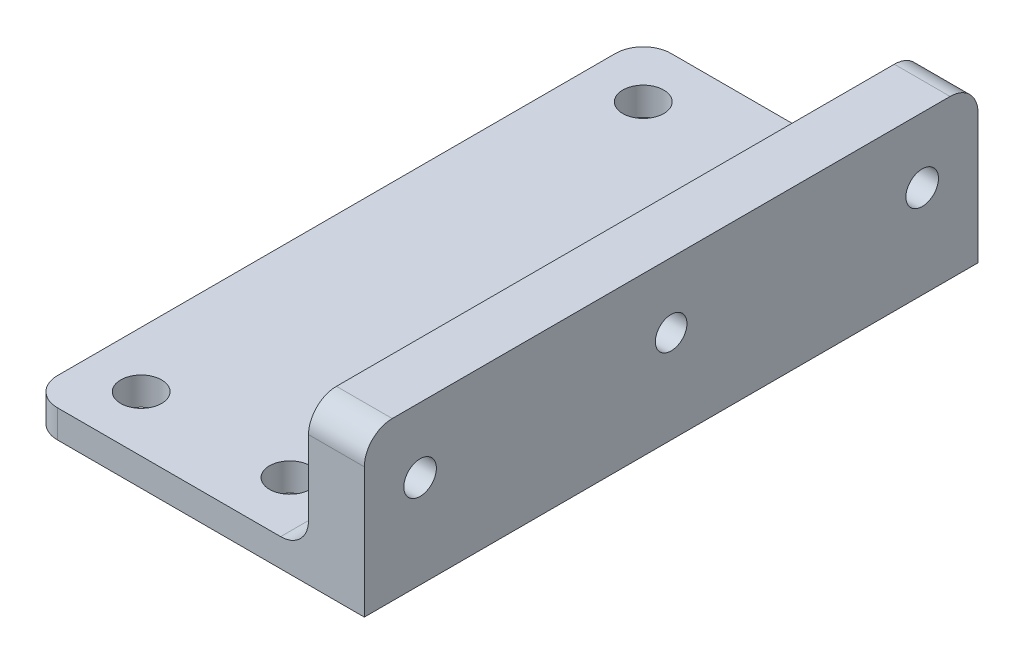
ISO-10303-21;
HEADER;
FILE_DESCRIPTION(('STEP AP214'),'2;1');
FILE_NAME('part.step','',(''),(''),'','','');
FILE_SCHEMA(('AUTOMOTIVE_DESIGN { 1 0 10303 214 1 1 1 1 }'));
ENDSEC;
DATA;
#1=APPLICATION_CONTEXT('core data for automotive mechanical design processes');
#2=APPLICATION_PROTOCOL_DEFINITION('international standard','automotive_design',2000,#1);
#3=PRODUCT_CONTEXT('',#1,'mechanical');
#4=PRODUCT('Part','Part','',(#3));
#5=PRODUCT_RELATED_PRODUCT_CATEGORY('part','',(#4));
#6=PRODUCT_DEFINITION_FORMATION('','',#4);
#7=PRODUCT_DEFINITION_CONTEXT('part definition',#1,'design');
#8=PRODUCT_DEFINITION('design','',#6,#7);
#9=PRODUCT_DEFINITION_SHAPE('','',#8);
#10=(LENGTH_UNIT() NAMED_UNIT(*) SI_UNIT(.MILLI.,.METRE.));
#11=(NAMED_UNIT(*) PLANE_ANGLE_UNIT() SI_UNIT($,.RADIAN.));
#12=(NAMED_UNIT(*) SI_UNIT($,.STERADIAN.) SOLID_ANGLE_UNIT());
#13=UNCERTAINTY_MEASURE_WITH_UNIT(LENGTH_MEASURE(1.E-05),#10,'distance_accuracy_value','');
#14=(GEOMETRIC_REPRESENTATION_CONTEXT(3) GLOBAL_UNCERTAINTY_ASSIGNED_CONTEXT((#13)) GLOBAL_UNIT_ASSIGNED_CONTEXT((#10,
#11,#12)) REPRESENTATION_CONTEXT('',''));
#15=CARTESIAN_POINT('',(0.,0.,0.));
#16=DIRECTION('',(0.,0.,1.));
#17=DIRECTION('',(1.,0.,0.));
#18=AXIS2_PLACEMENT_3D('',#15,#16,#17);
#19=CARTESIAN_POINT('',(0.,3.,0.));
#20=DIRECTION('',(0.,-1.,0.));
#21=DIRECTION('',(0.,0.,-1.));
#22=AXIS2_PLACEMENT_3D('',#19,#20,#21);
#23=PLANE('',#22);
#24=CARTESIAN_POINT('',(22.,3.,-60.));
#25=DIRECTION('',(0.,1.,0.));
#26=DIRECTION('',(0.,0.,-1.));
#27=AXIS2_PLACEMENT_3D('',#24,#25,#26);
#28=CIRCLE('',#27,2.2);
#29=CARTESIAN_POINT('',(22.,3.,-62.2));
#30=VERTEX_POINT('',#29);
#31=EDGE_CURVE('E277',#30,#30,#28,.T.);
#32=ORIENTED_EDGE('',*,*,#31,.F.);
#33=EDGE_LOOP('',(#32));
#34=FACE_BOUND('',#33,.T.);
#35=CARTESIAN_POINT('',(22.,3.,-6.));
#36=DIRECTION('',(0.,1.,0.));
#37=DIRECTION('',(0.,0.,1.));
#38=AXIS2_PLACEMENT_3D('',#35,#36,#37);
#39=CIRCLE('',#38,2.2);
#40=CARTESIAN_POINT('',(22.,3.,-3.8));
#41=VERTEX_POINT('',#40);
#42=EDGE_CURVE('E287',#41,#41,#39,.T.);
#43=ORIENTED_EDGE('',*,*,#42,.F.);
#44=EDGE_LOOP('',(#43));
#45=FACE_BOUND('',#44,.T.);
#46=CARTESIAN_POINT('',(6.,3.,-6.));
#47=DIRECTION('',(0.,1.,0.));
#48=DIRECTION('',(0.,0.,-1.));
#49=AXIS2_PLACEMENT_3D('',#46,#47,#48);
#50=CIRCLE('',#49,2.2);
#51=CARTESIAN_POINT('',(6.,3.,-8.2));
#52=VERTEX_POINT('',#51);
#53=EDGE_CURVE('E295',#52,#52,#50,.T.);
#54=ORIENTED_EDGE('',*,*,#53,.F.);
#55=EDGE_LOOP('',(#54));
#56=FACE_BOUND('',#55,.T.);
#57=CARTESIAN_POINT('',(6.,3.,-60.));
#58=DIRECTION('',(0.,1.,0.));
#59=DIRECTION('',(0.,0.,1.));
#60=AXIS2_PLACEMENT_3D('',#57,#58,#59);
#61=CIRCLE('',#60,2.2);
#62=CARTESIAN_POINT('',(6.,3.,-57.8));
#63=VERTEX_POINT('',#62);
#64=EDGE_CURVE('E303',#63,#63,#61,.T.);
#65=ORIENTED_EDGE('',*,*,#64,.F.);
#66=EDGE_LOOP('',(#65));
#67=FACE_BOUND('',#66,.T.);
#68=DIRECTION('',(0.,0.,1.));
#69=VECTOR('',#68,1.);
#70=CARTESIAN_POINT('',(0.,3.,0.));
#71=LINE('',#70,#69);
#72=CARTESIAN_POINT('',(0.,3.,-63.));
#73=VERTEX_POINT('',#72);
#74=CARTESIAN_POINT('',(0.,3.,-3.));
#75=VERTEX_POINT('',#74);
#76=EDGE_CURVE('E165',#73,#75,#71,.T.);
#77=ORIENTED_EDGE('',*,*,#76,.T.);
#78=CARTESIAN_POINT('',(3.,3.,-3.));
#79=DIRECTION('',(0.,-1.,0.));
#80=DIRECTION('',(0.,0.,-1.));
#81=AXIS2_PLACEMENT_3D('',#78,#79,#80);
#82=CIRCLE('',#81,3.);
#83=CARTESIAN_POINT('',(3.,3.,0.));
#84=VERTEX_POINT('',#83);
#85=EDGE_CURVE('E246',#75,#84,#82,.F.);
#86=ORIENTED_EDGE('',*,*,#85,.T.);
#87=DIRECTION('',(1.,0.,0.));
#88=VECTOR('',#87,1.);
#89=CARTESIAN_POINT('',(0.,3.,0.));
#90=LINE('',#89,#88);
#91=CARTESIAN_POINT('',(27.,3.,0.));
#92=VERTEX_POINT('',#91);
#93=EDGE_CURVE('E251',#84,#92,#90,.T.);
#94=ORIENTED_EDGE('',*,*,#93,.T.);
#95=DIRECTION('',(0.,0.,1.));
#96=VECTOR('',#95,1.);
#97=CARTESIAN_POINT('',(27.,3.,-66.));
#98=LINE('',#97,#96);
#99=CARTESIAN_POINT('',(27.,3.,-66.));
#100=VERTEX_POINT('',#99);
#101=EDGE_CURVE('E241',#92,#100,#98,.F.);
#102=ORIENTED_EDGE('',*,*,#101,.T.);
#103=DIRECTION('',(-1.,0.,0.));
#104=VECTOR('',#103,1.);
#105=CARTESIAN_POINT('',(0.,3.,-66.));
#106=LINE('',#105,#104);
#107=CARTESIAN_POINT('',(3.,3.,-66.));
#108=VERTEX_POINT('',#107);
#109=EDGE_CURVE('E170',#100,#108,#106,.T.);
#110=ORIENTED_EDGE('',*,*,#109,.T.);
#111=CARTESIAN_POINT('',(3.,3.,-63.));
#112=DIRECTION('',(0.,-1.,0.));
#113=DIRECTION('',(0.,0.,-1.));
#114=AXIS2_PLACEMENT_3D('',#111,#112,#113);
#115=CIRCLE('',#114,3.);
#116=EDGE_CURVE('E70',#108,#73,#115,.F.);
#117=ORIENTED_EDGE('',*,*,#116,.T.);
#118=EDGE_LOOP('',(#77,#86,#94,#102,#110,#117));
#119=FACE_BOUND('',#118,.T.);
#120=ADVANCED_FACE('F47',(#34,#45,#56,#67,#119),#23,.F.);
#121=CARTESIAN_POINT('',(0.,0.,0.));
#122=DIRECTION('',(0.,-1.,0.));
#123=DIRECTION('',(0.,0.,-1.));
#124=AXIS2_PLACEMENT_3D('',#121,#122,#123);
#125=PLANE('',#124);
#126=CARTESIAN_POINT('',(22.,0.,-6.));
#127=DIRECTION('',(0.,1.,0.));
#128=DIRECTION('',(0.,0.,1.));
#129=AXIS2_PLACEMENT_3D('',#126,#127,#128);
#130=CIRCLE('',#129,2.2);
#131=CARTESIAN_POINT('',(22.,0.,-3.8));
#132=VERTEX_POINT('',#131);
#133=EDGE_CURVE('E285',#132,#132,#130,.T.);
#134=ORIENTED_EDGE('',*,*,#133,.T.);
#135=EDGE_LOOP('',(#134));
#136=FACE_BOUND('',#135,.T.);
#137=CARTESIAN_POINT('',(6.,0.,-60.));
#138=DIRECTION('',(0.,1.,0.));
#139=DIRECTION('',(0.,0.,1.));
#140=AXIS2_PLACEMENT_3D('',#137,#138,#139);
#141=CIRCLE('',#140,2.2);
#142=CARTESIAN_POINT('',(6.,0.,-57.8));
#143=VERTEX_POINT('',#142);
#144=EDGE_CURVE('E299',#143,#143,#141,.T.);
#145=ORIENTED_EDGE('',*,*,#144,.T.);
#146=EDGE_LOOP('',(#145));
#147=FACE_BOUND('',#146,.T.);
#148=DIRECTION('',(1.,0.,0.));
#149=VECTOR('',#148,1.);
#150=CARTESIAN_POINT('',(0.,0.,0.));
#151=LINE('',#150,#149);
#152=CARTESIAN_POINT('',(3.,0.,0.));
#153=VERTEX_POINT('',#152);
#154=CARTESIAN_POINT('',(36.,0.,0.));
#155=VERTEX_POINT('',#154);
#156=EDGE_CURVE('E133',#153,#155,#151,.T.);
#157=ORIENTED_EDGE('',*,*,#156,.F.);
#158=CARTESIAN_POINT('',(3.,0.,-3.));
#159=DIRECTION('',(0.,-1.,0.));
#160=DIRECTION('',(0.,0.,-1.));
#161=AXIS2_PLACEMENT_3D('',#158,#159,#160);
#162=CIRCLE('',#161,3.);
#163=CARTESIAN_POINT('',(0.,0.,-3.));
#164=VERTEX_POINT('',#163);
#165=EDGE_CURVE('E232',#153,#164,#162,.T.);
#166=ORIENTED_EDGE('',*,*,#165,.T.);
#167=DIRECTION('',(0.,0.,1.));
#168=VECTOR('',#167,1.);
#169=CARTESIAN_POINT('',(0.,0.,0.));
#170=LINE('',#169,#168);
#171=CARTESIAN_POINT('',(0.,0.,-63.));
#172=VERTEX_POINT('',#171);
#173=EDGE_CURVE('E145',#172,#164,#170,.T.);
#174=ORIENTED_EDGE('',*,*,#173,.F.);
#175=CARTESIAN_POINT('',(3.,0.,-63.));
#176=DIRECTION('',(0.,-1.,0.));
#177=DIRECTION('',(0.,0.,-1.));
#178=AXIS2_PLACEMENT_3D('',#175,#176,#177);
#179=CIRCLE('',#178,3.);
#180=CARTESIAN_POINT('',(3.,0.,-66.));
#181=VERTEX_POINT('',#180);
#182=EDGE_CURVE('E229',#172,#181,#179,.T.);
#183=ORIENTED_EDGE('',*,*,#182,.T.);
#184=DIRECTION('',(-1.,0.,0.));
#185=VECTOR('',#184,1.);
#186=CARTESIAN_POINT('',(0.,0.,-66.));
#187=LINE('',#186,#185);
#188=CARTESIAN_POINT('',(36.,0.,-66.));
#189=VERTEX_POINT('',#188);
#190=EDGE_CURVE('E161',#189,#181,#187,.T.);
#191=ORIENTED_EDGE('',*,*,#190,.F.);
#192=DIRECTION('',(0.,0.,-1.));
#193=VECTOR('',#192,1.);
#194=CARTESIAN_POINT('',(36.,0.,0.));
#195=LINE('',#194,#193);
#196=EDGE_CURVE('E144',#155,#189,#195,.T.);
#197=ORIENTED_EDGE('',*,*,#196,.F.);
#198=EDGE_LOOP('',(#157,#166,#174,#183,#191,#197));
#199=FACE_BOUND('',#198,.T.);
#200=CARTESIAN_POINT('',(6.,0.,-6.));
#201=DIRECTION('',(0.,1.,0.));
#202=DIRECTION('',(0.,0.,-1.));
#203=AXIS2_PLACEMENT_3D('',#200,#201,#202);
#204=CIRCLE('',#203,2.2);
#205=CARTESIAN_POINT('',(6.,0.,-8.2));
#206=VERTEX_POINT('',#205);
#207=EDGE_CURVE('E291',#206,#206,#204,.T.);
#208=ORIENTED_EDGE('',*,*,#207,.T.);
#209=EDGE_LOOP('',(#208));
#210=FACE_BOUND('',#209,.T.);
#211=CARTESIAN_POINT('',(22.,0.,-60.));
#212=DIRECTION('',(0.,1.,0.));
#213=DIRECTION('',(0.,0.,-1.));
#214=AXIS2_PLACEMENT_3D('',#211,#212,#213);
#215=CIRCLE('',#214,2.2);
#216=CARTESIAN_POINT('',(22.,0.,-62.2));
#217=VERTEX_POINT('',#216);
#218=EDGE_CURVE('E272',#217,#217,#215,.T.);
#219=ORIENTED_EDGE('',*,*,#218,.T.);
#220=EDGE_LOOP('',(#219));
#221=FACE_BOUND('',#220,.T.);
#222=ADVANCED_FACE('F158',(#136,#147,#199,#210,#221),#125,.T.);
#223=CARTESIAN_POINT('',(0.,3.,0.));
#224=DIRECTION('',(1.,0.,0.));
#225=DIRECTION('',(0.,0.,-1.));
#226=AXIS2_PLACEMENT_3D('',#223,#224,#225);
#227=PLANE('',#226);
#228=ORIENTED_EDGE('',*,*,#173,.T.);
#229=DIRECTION('',(0.,-1.,0.));
#230=VECTOR('',#229,1.);
#231=CARTESIAN_POINT('',(0.,3.,-3.));
#232=LINE('',#231,#230);
#233=EDGE_CURVE('E63',#164,#75,#232,.F.);
#234=ORIENTED_EDGE('',*,*,#233,.T.);
#235=ORIENTED_EDGE('',*,*,#76,.F.);
#236=DIRECTION('',(0.,-1.,0.));
#237=VECTOR('',#236,1.);
#238=CARTESIAN_POINT('',(0.,3.,-63.));
#239=LINE('',#238,#237);
#240=EDGE_CURVE('E235',#73,#172,#239,.T.);
#241=ORIENTED_EDGE('',*,*,#240,.T.);
#242=EDGE_LOOP('',(#228,#234,#235,#241));
#243=FACE_BOUND('',#242,.T.);
#244=ADVANCED_FACE('F315',(#243),#227,.F.);
#245=CARTESIAN_POINT('',(0.,3.,0.));
#246=DIRECTION('',(0.,0.,-1.));
#247=DIRECTION('',(-1.,0.,0.));
#248=AXIS2_PLACEMENT_3D('',#245,#246,#247);
#249=PLANE('',#248);
#250=DIRECTION('',(0.,-1.,0.));
#251=VECTOR('',#250,1.);
#252=CARTESIAN_POINT('',(36.,3.,0.));
#253=LINE('',#252,#251);
#254=CARTESIAN_POINT('',(36.,14.,0.));
#255=VERTEX_POINT('',#254);
#256=EDGE_CURVE('E136',#255,#155,#253,.T.);
#257=ORIENTED_EDGE('',*,*,#256,.F.);
#258=DIRECTION('',(1.,0.,0.));
#259=VECTOR('',#258,1.);
#260=CARTESIAN_POINT('',(30.,14.,0.));
#261=LINE('',#260,#259);
#262=CARTESIAN_POINT('',(30.,14.,0.));
#263=VERTEX_POINT('',#262);
#264=EDGE_CURVE('E210',#255,#263,#261,.F.);
#265=ORIENTED_EDGE('',*,*,#264,.T.);
#266=DIRECTION('',(0.,-1.,0.));
#267=VECTOR('',#266,1.);
#268=CARTESIAN_POINT('',(30.,17.,0.));
#269=LINE('',#268,#267);
#270=CARTESIAN_POINT('',(30.,6.,0.));
#271=VERTEX_POINT('',#270);
#272=EDGE_CURVE('E253',#263,#271,#269,.T.);
#273=ORIENTED_EDGE('',*,*,#272,.T.);
#274=CARTESIAN_POINT('',(27.,6.,0.));
#275=DIRECTION('',(0.,0.,-1.));
#276=DIRECTION('',(-1.,0.,0.));
#277=AXIS2_PLACEMENT_3D('',#274,#275,#276);
#278=CIRCLE('',#277,3.);
#279=EDGE_CURVE('E56',#271,#92,#278,.T.);
#280=ORIENTED_EDGE('',*,*,#279,.T.);
#281=ORIENTED_EDGE('',*,*,#93,.F.);
#282=DIRECTION('',(0.,-1.,0.));
#283=VECTOR('',#282,1.);
#284=CARTESIAN_POINT('',(3.,3.,0.));
#285=LINE('',#284,#283);
#286=EDGE_CURVE('E140',#84,#153,#285,.T.);
#287=ORIENTED_EDGE('',*,*,#286,.T.);
#288=ORIENTED_EDGE('',*,*,#156,.T.);
#289=EDGE_LOOP('',(#257,#265,#273,#280,#281,#287,#288));
#290=FACE_BOUND('',#289,.T.);
#291=ADVANCED_FACE('F135',(#290),#249,.F.);
#292=CARTESIAN_POINT('',(36.,3.,0.));
#293=DIRECTION('',(-1.,0.,0.));
#294=DIRECTION('',(0.,0.,1.));
#295=AXIS2_PLACEMENT_3D('',#292,#293,#294);
#296=PLANE('',#295);
#297=CARTESIAN_POINT('',(36.,10.,-60.));
#298=DIRECTION('',(-1.,0.,0.));
#299=DIRECTION('',(0.,0.,-1.));
#300=AXIS2_PLACEMENT_3D('',#297,#298,#299);
#301=CIRCLE('',#300,1.75203712425774);
#302=CARTESIAN_POINT('',(36.,10.,-61.7520371242577));
#303=VERTEX_POINT('',#302);
#304=EDGE_CURVE('E398',#303,#303,#301,.T.);
#305=ORIENTED_EDGE('',*,*,#304,.T.);
#306=EDGE_LOOP('',(#305));
#307=FACE_BOUND('',#306,.T.);
#308=CARTESIAN_POINT('',(36.,10.,-6.));
#309=DIRECTION('',(-1.,0.,0.));
#310=DIRECTION('',(0.,0.,1.));
#311=AXIS2_PLACEMENT_3D('',#308,#309,#310);
#312=CIRCLE('',#311,1.75203712425774);
#313=CARTESIAN_POINT('',(36.,10.,-4.24796287574226));
#314=VERTEX_POINT('',#313);
#315=EDGE_CURVE('E397',#314,#314,#312,.T.);
#316=ORIENTED_EDGE('',*,*,#315,.T.);
#317=EDGE_LOOP('',(#316));
#318=FACE_BOUND('',#317,.T.);
#319=CARTESIAN_POINT('',(36.,10.,-33.));
#320=DIRECTION('',(-1.,0.,0.));
#321=DIRECTION('',(0.,0.,1.));
#322=AXIS2_PLACEMENT_3D('',#319,#320,#321);
#323=CIRCLE('',#322,1.7);
#324=CARTESIAN_POINT('',(36.,10.,-31.3));
#325=VERTEX_POINT('',#324);
#326=EDGE_CURVE('E391',#325,#325,#323,.T.);
#327=ORIENTED_EDGE('',*,*,#326,.T.);
#328=EDGE_LOOP('',(#327));
#329=FACE_BOUND('',#328,.T.);
#330=DIRECTION('',(0.,0.,-1.));
#331=VECTOR('',#330,1.);
#332=CARTESIAN_POINT('',(36.,17.,0.));
#333=LINE('',#332,#331);
#334=CARTESIAN_POINT('',(36.,17.,-3.));
#335=VERTEX_POINT('',#334);
#336=CARTESIAN_POINT('',(36.,17.,-63.));
#337=VERTEX_POINT('',#336);
#338=EDGE_CURVE('E389',#335,#337,#333,.T.);
#339=ORIENTED_EDGE('',*,*,#338,.F.);
#340=CARTESIAN_POINT('',(36.,14.,-3.));
#341=DIRECTION('',(-1.,0.,0.));
#342=DIRECTION('',(0.,0.,1.));
#343=AXIS2_PLACEMENT_3D('',#340,#341,#342);
#344=CIRCLE('',#343,3.);
#345=EDGE_CURVE('E153',#335,#255,#344,.F.);
#346=ORIENTED_EDGE('',*,*,#345,.T.);
#347=ORIENTED_EDGE('',*,*,#256,.T.);
#348=ORIENTED_EDGE('',*,*,#196,.T.);
#349=DIRECTION('',(0.,-1.,0.));
#350=VECTOR('',#349,1.);
#351=CARTESIAN_POINT('',(36.,3.,-66.));
#352=LINE('',#351,#350);
#353=CARTESIAN_POINT('',(36.,14.,-66.));
#354=VERTEX_POINT('',#353);
#355=EDGE_CURVE('E156',#354,#189,#352,.T.);
#356=ORIENTED_EDGE('',*,*,#355,.F.);
#357=CARTESIAN_POINT('',(36.,14.,-63.));
#358=DIRECTION('',(-1.,0.,0.));
#359=DIRECTION('',(0.,0.,1.));
#360=AXIS2_PLACEMENT_3D('',#357,#358,#359);
#361=CIRCLE('',#360,3.);
#362=EDGE_CURVE('E203',#354,#337,#361,.F.);
#363=ORIENTED_EDGE('',*,*,#362,.T.);
#364=EDGE_LOOP('',(#339,#346,#347,#348,#356,#363));
#365=FACE_BOUND('',#364,.T.);
#366=ADVANCED_FACE('F150',(#307,#318,#329,#365),#296,.F.);
#367=CARTESIAN_POINT('',(0.,3.,-66.));
#368=DIRECTION('',(0.,0.,1.));
#369=DIRECTION('',(1.,0.,0.));
#370=AXIS2_PLACEMENT_3D('',#367,#368,#369);
#371=PLANE('',#370);
#372=DIRECTION('',(0.,-1.,0.));
#373=VECTOR('',#372,1.);
#374=CARTESIAN_POINT('',(30.,17.,-66.));
#375=LINE('',#374,#373);
#376=CARTESIAN_POINT('',(30.,14.,-66.));
#377=VERTEX_POINT('',#376);
#378=CARTESIAN_POINT('',(30.,6.,-66.));
#379=VERTEX_POINT('',#378);
#380=EDGE_CURVE('E266',#377,#379,#375,.T.);
#381=ORIENTED_EDGE('',*,*,#380,.F.);
#382=DIRECTION('',(-1.,0.,0.));
#383=VECTOR('',#382,1.);
#384=CARTESIAN_POINT('',(36.,14.,-66.));
#385=LINE('',#384,#383);
#386=EDGE_CURVE('E226',#377,#354,#385,.F.);
#387=ORIENTED_EDGE('',*,*,#386,.T.);
#388=ORIENTED_EDGE('',*,*,#355,.T.);
#389=ORIENTED_EDGE('',*,*,#190,.T.);
#390=DIRECTION('',(0.,-1.,0.));
#391=VECTOR('',#390,1.);
#392=CARTESIAN_POINT('',(3.,3.,-66.));
#393=LINE('',#392,#391);
#394=EDGE_CURVE('E223',#181,#108,#393,.F.);
#395=ORIENTED_EDGE('',*,*,#394,.T.);
#396=ORIENTED_EDGE('',*,*,#109,.F.);
#397=CARTESIAN_POINT('',(27.,6.,-66.));
#398=DIRECTION('',(0.,0.,1.));
#399=DIRECTION('',(1.,0.,0.));
#400=AXIS2_PLACEMENT_3D('',#397,#398,#399);
#401=CIRCLE('',#400,3.);
#402=EDGE_CURVE('E11',#100,#379,#401,.T.);
#403=ORIENTED_EDGE('',*,*,#402,.T.);
#404=EDGE_LOOP('',(#381,#387,#388,#389,#395,#396,#403));
#405=FACE_BOUND('',#404,.T.);
#406=ADVANCED_FACE('F265',(#405),#371,.F.);
#407=CARTESIAN_POINT('',(6.,3.,-60.));
#408=DIRECTION('',(0.,-1.,0.));
#409=DIRECTION('',(0.,0.,-1.));
#410=AXIS2_PLACEMENT_3D('',#407,#408,#409);
#411=CYLINDRICAL_SURFACE('',#410,2.2);
#412=ORIENTED_EDGE('',*,*,#64,.T.);
#413=EDGE_LOOP('',(#412));
#414=FACE_BOUND('',#413,.T.);
#415=ORIENTED_EDGE('',*,*,#144,.F.);
#416=EDGE_LOOP('',(#415));
#417=FACE_BOUND('',#416,.T.);
#418=ADVANCED_FACE('F343',(#414,#417),#411,.F.);
#419=CARTESIAN_POINT('',(6.,3.,-6.));
#420=DIRECTION('',(0.,-1.,0.));
#421=DIRECTION('',(0.,0.,-1.));
#422=AXIS2_PLACEMENT_3D('',#419,#420,#421);
#423=CYLINDRICAL_SURFACE('',#422,2.2);
#424=ORIENTED_EDGE('',*,*,#53,.T.);
#425=EDGE_LOOP('',(#424));
#426=FACE_BOUND('',#425,.T.);
#427=ORIENTED_EDGE('',*,*,#207,.F.);
#428=EDGE_LOOP('',(#427));
#429=FACE_BOUND('',#428,.T.);
#430=ADVANCED_FACE('F432',(#426,#429),#423,.F.);
#431=CARTESIAN_POINT('',(22.,3.,-6.));
#432=DIRECTION('',(0.,-1.,0.));
#433=DIRECTION('',(0.,0.,-1.));
#434=AXIS2_PLACEMENT_3D('',#431,#432,#433);
#435=CYLINDRICAL_SURFACE('',#434,2.2);
#436=ORIENTED_EDGE('',*,*,#42,.T.);
#437=EDGE_LOOP('',(#436));
#438=FACE_BOUND('',#437,.T.);
#439=ORIENTED_EDGE('',*,*,#133,.F.);
#440=EDGE_LOOP('',(#439));
#441=FACE_BOUND('',#440,.T.);
#442=ADVANCED_FACE('F429',(#438,#441),#435,.F.);
#443=CARTESIAN_POINT('',(22.,3.,-60.));
#444=DIRECTION('',(0.,-1.,0.));
#445=DIRECTION('',(0.,0.,-1.));
#446=AXIS2_PLACEMENT_3D('',#443,#444,#445);
#447=CYLINDRICAL_SURFACE('',#446,2.2);
#448=ORIENTED_EDGE('',*,*,#31,.T.);
#449=EDGE_LOOP('',(#448));
#450=FACE_BOUND('',#449,.T.);
#451=ORIENTED_EDGE('',*,*,#218,.F.);
#452=EDGE_LOOP('',(#451));
#453=FACE_BOUND('',#452,.T.);
#454=ADVANCED_FACE('F425',(#450,#453),#447,.F.);
#455=CARTESIAN_POINT('',(30.,17.,0.));
#456=DIRECTION('',(1.,0.,0.));
#457=DIRECTION('',(0.,0.,-1.));
#458=AXIS2_PLACEMENT_3D('',#455,#456,#457);
#459=PLANE('',#458);
#460=CARTESIAN_POINT('',(30.,10.,-6.));
#461=DIRECTION('',(1.,0.,0.));
#462=DIRECTION('',(0.,0.,-1.));
#463=AXIS2_PLACEMENT_3D('',#460,#461,#462);
#464=CIRCLE('',#463,3.45203712425775);
#465=CARTESIAN_POINT('',(30.,10.,-9.45203712425775));
#466=VERTEX_POINT('',#465);
#467=EDGE_CURVE('E183',#466,#466,#464,.T.);
#468=ORIENTED_EDGE('',*,*,#467,.T.);
#469=EDGE_LOOP('',(#468));
#470=FACE_BOUND('',#469,.T.);
#471=CARTESIAN_POINT('',(30.,10.,-33.));
#472=DIRECTION('',(1.,0.,0.));
#473=DIRECTION('',(0.,0.,-1.));
#474=AXIS2_PLACEMENT_3D('',#471,#472,#473);
#475=CIRCLE('',#474,3.39999999999999);
#476=CARTESIAN_POINT('',(30.,10.,-36.4));
#477=VERTEX_POINT('',#476);
#478=EDGE_CURVE('E179',#477,#477,#475,.T.);
#479=ORIENTED_EDGE('',*,*,#478,.T.);
#480=EDGE_LOOP('',(#479));
#481=FACE_BOUND('',#480,.T.);
#482=CARTESIAN_POINT('',(30.,10.,-60.));
#483=DIRECTION('',(1.,0.,0.));
#484=DIRECTION('',(0.,0.,-1.));
#485=AXIS2_PLACEMENT_3D('',#482,#483,#484);
#486=CIRCLE('',#485,3.45203712425774);
#487=CARTESIAN_POINT('',(30.,10.,-63.4520371242577));
#488=VERTEX_POINT('',#487);
#489=EDGE_CURVE('E175',#488,#488,#486,.T.);
#490=ORIENTED_EDGE('',*,*,#489,.T.);
#491=EDGE_LOOP('',(#490));
#492=FACE_BOUND('',#491,.T.);
#493=ORIENTED_EDGE('',*,*,#272,.F.);
#494=CARTESIAN_POINT('',(30.,14.,-3.));
#495=DIRECTION('',(1.,0.,0.));
#496=DIRECTION('',(0.,0.,-1.));
#497=AXIS2_PLACEMENT_3D('',#494,#495,#496);
#498=CIRCLE('',#497,3.);
#499=CARTESIAN_POINT('',(30.,17.,-3.));
#500=VERTEX_POINT('',#499);
#501=EDGE_CURVE('E220',#263,#500,#498,.F.);
#502=ORIENTED_EDGE('',*,*,#501,.T.);
#503=DIRECTION('',(0.,0.,1.));
#504=VECTOR('',#503,1.);
#505=CARTESIAN_POINT('',(30.,17.,0.));
#506=LINE('',#505,#504);
#507=CARTESIAN_POINT('',(30.,17.,-63.));
#508=VERTEX_POINT('',#507);
#509=EDGE_CURVE('E279',#508,#500,#506,.T.);
#510=ORIENTED_EDGE('',*,*,#509,.F.);
#511=CARTESIAN_POINT('',(30.,14.,-63.));
#512=DIRECTION('',(1.,0.,0.));
#513=DIRECTION('',(0.,0.,-1.));
#514=AXIS2_PLACEMENT_3D('',#511,#512,#513);
#515=CIRCLE('',#514,3.);
#516=EDGE_CURVE('E217',#508,#377,#515,.F.);
#517=ORIENTED_EDGE('',*,*,#516,.T.);
#518=ORIENTED_EDGE('',*,*,#380,.T.);
#519=DIRECTION('',(0.,0.,1.));
#520=VECTOR('',#519,1.);
#521=CARTESIAN_POINT('',(30.,6.,0.));
#522=LINE('',#521,#520);
#523=EDGE_CURVE('E213',#379,#271,#522,.T.);
#524=ORIENTED_EDGE('',*,*,#523,.T.);
#525=EDGE_LOOP('',(#493,#502,#510,#517,#518,#524));
#526=FACE_BOUND('',#525,.T.);
#527=ADVANCED_FACE('F269',(#470,#481,#492,#526),#459,.F.);
#528=CARTESIAN_POINT('',(0.,17.,0.));
#529=DIRECTION('',(0.,1.,0.));
#530=DIRECTION('',(0.,0.,1.));
#531=AXIS2_PLACEMENT_3D('',#528,#529,#530);
#532=PLANE('',#531);
#533=ORIENTED_EDGE('',*,*,#509,.T.);
#534=DIRECTION('',(1.,0.,0.));
#535=VECTOR('',#534,1.);
#536=CARTESIAN_POINT('',(36.,17.,-3.));
#537=LINE('',#536,#535);
#538=EDGE_CURVE('E199',#500,#335,#537,.T.);
#539=ORIENTED_EDGE('',*,*,#538,.T.);
#540=ORIENTED_EDGE('',*,*,#338,.T.);
#541=DIRECTION('',(-1.,0.,0.));
#542=VECTOR('',#541,1.);
#543=CARTESIAN_POINT('',(30.,17.,-63.));
#544=LINE('',#543,#542);
#545=EDGE_CURVE('E195',#337,#508,#544,.T.);
#546=ORIENTED_EDGE('',*,*,#545,.T.);
#547=EDGE_LOOP('',(#533,#539,#540,#546));
#548=FACE_BOUND('',#547,.T.);
#549=ADVANCED_FACE('F385',(#548),#532,.T.);
#550=CARTESIAN_POINT('',(36.,10.,-33.));
#551=DIRECTION('',(-1.,0.,0.));
#552=DIRECTION('',(0.,0.,1.));
#553=AXIS2_PLACEMENT_3D('',#550,#551,#552);
#554=CYLINDRICAL_SURFACE('',#553,1.7);
#555=CARTESIAN_POINT('',(31.7,10.,-33.));
#556=DIRECTION('',(1.,0.,0.));
#557=DIRECTION('',(0.,0.,-1.));
#558=AXIS2_PLACEMENT_3D('',#555,#556,#557);
#559=CIRCLE('',#558,1.7);
#560=CARTESIAN_POINT('',(31.7,10.,-34.7));
#561=VERTEX_POINT('',#560);
#562=EDGE_CURVE('E187',#561,#561,#559,.F.);
#563=ORIENTED_EDGE('',*,*,#562,.T.);
#564=EDGE_LOOP('',(#563));
#565=FACE_BOUND('',#564,.T.);
#566=ORIENTED_EDGE('',*,*,#326,.F.);
#567=EDGE_LOOP('',(#566));
#568=FACE_BOUND('',#567,.T.);
#569=ADVANCED_FACE('F410',(#565,#568),#554,.F.);
#570=CARTESIAN_POINT('',(36.,10.,-6.));
#571=DIRECTION('',(-1.,0.,0.));
#572=DIRECTION('',(0.,0.,1.));
#573=AXIS2_PLACEMENT_3D('',#570,#571,#572);
#574=CYLINDRICAL_SURFACE('',#573,1.75203712425774);
#575=CARTESIAN_POINT('',(31.7,10.,-6.));
#576=DIRECTION('',(1.,0.,0.));
#577=DIRECTION('',(0.,0.,-1.));
#578=AXIS2_PLACEMENT_3D('',#575,#576,#577);
#579=CIRCLE('',#578,1.75203712425774);
#580=CARTESIAN_POINT('',(31.7,10.,-7.75203712425774));
#581=VERTEX_POINT('',#580);
#582=EDGE_CURVE('E155',#581,#581,#579,.F.);
#583=ORIENTED_EDGE('',*,*,#582,.T.);
#584=EDGE_LOOP('',(#583));
#585=FACE_BOUND('',#584,.T.);
#586=ORIENTED_EDGE('',*,*,#315,.F.);
#587=EDGE_LOOP('',(#586));
#588=FACE_BOUND('',#587,.T.);
#589=ADVANCED_FACE('F408',(#585,#588),#574,.F.);
#590=CARTESIAN_POINT('',(36.,10.,-60.));
#591=DIRECTION('',(-1.,0.,0.));
#592=DIRECTION('',(0.,0.,1.));
#593=AXIS2_PLACEMENT_3D('',#590,#591,#592);
#594=CYLINDRICAL_SURFACE('',#593,1.75203712425774);
#595=CARTESIAN_POINT('',(31.7,10.,-60.));
#596=DIRECTION('',(1.,0.,0.));
#597=DIRECTION('',(0.,0.,-1.));
#598=AXIS2_PLACEMENT_3D('',#595,#596,#597);
#599=CIRCLE('',#598,1.75203712425774);
#600=CARTESIAN_POINT('',(31.7,10.,-61.7520371242577));
#601=VERTEX_POINT('',#600);
#602=EDGE_CURVE('E191',#601,#601,#599,.F.);
#603=ORIENTED_EDGE('',*,*,#602,.T.);
#604=EDGE_LOOP('',(#603));
#605=FACE_BOUND('',#604,.T.);
#606=ORIENTED_EDGE('',*,*,#304,.F.);
#607=EDGE_LOOP('',(#606));
#608=FACE_BOUND('',#607,.T.);
#609=ADVANCED_FACE('F363',(#605,#608),#594,.F.);
#610=CARTESIAN_POINT('',(31.7,10.,-6.));
#611=DIRECTION('',(-1.,0.,0.));
#612=DIRECTION('',(0.,0.,1.));
#613=AXIS2_PLACEMENT_3D('',#610,#611,#612);
#614=CONICAL_SURFACE('',#613,1.75203712425774,0.78539816339745);
#615=ORIENTED_EDGE('',*,*,#467,.F.);
#616=EDGE_LOOP('',(#615));
#617=FACE_BOUND('',#616,.T.);
#618=ORIENTED_EDGE('',*,*,#582,.F.);
#619=EDGE_LOOP('',(#618));
#620=FACE_BOUND('',#619,.T.);
#621=ADVANCED_FACE('F356',(#617,#620),#614,.F.);
#622=CARTESIAN_POINT('',(31.7,10.,-33.));
#623=DIRECTION('',(-1.,0.,0.));
#624=DIRECTION('',(0.,0.,1.));
#625=AXIS2_PLACEMENT_3D('',#622,#623,#624);
#626=CONICAL_SURFACE('',#625,1.7,0.78539816339745);
#627=ORIENTED_EDGE('',*,*,#478,.F.);
#628=EDGE_LOOP('',(#627));
#629=FACE_BOUND('',#628,.T.);
#630=ORIENTED_EDGE('',*,*,#562,.F.);
#631=EDGE_LOOP('',(#630));
#632=FACE_BOUND('',#631,.T.);
#633=ADVANCED_FACE('F362',(#629,#632),#626,.F.);
#634=CARTESIAN_POINT('',(31.7,10.,-60.));
#635=DIRECTION('',(-1.,0.,0.));
#636=DIRECTION('',(0.,0.,1.));
#637=AXIS2_PLACEMENT_3D('',#634,#635,#636);
#638=CONICAL_SURFACE('',#637,1.75203712425774,0.78539816339745);
#639=ORIENTED_EDGE('',*,*,#489,.F.);
#640=EDGE_LOOP('',(#639));
#641=FACE_BOUND('',#640,.T.);
#642=ORIENTED_EDGE('',*,*,#602,.F.);
#643=EDGE_LOOP('',(#642));
#644=FACE_BOUND('',#643,.T.);
#645=ADVANCED_FACE('F370',(#641,#644),#638,.F.);
#646=CARTESIAN_POINT('',(0.,14.,-3.));
#647=DIRECTION('',(-1.,0.,0.));
#648=DIRECTION('',(0.,0.,1.));
#649=AXIS2_PLACEMENT_3D('',#646,#647,#648);
#650=CYLINDRICAL_SURFACE('',#649,3.);
#651=ORIENTED_EDGE('',*,*,#501,.F.);
#652=ORIENTED_EDGE('',*,*,#264,.F.);
#653=ORIENTED_EDGE('',*,*,#345,.F.);
#654=ORIENTED_EDGE('',*,*,#538,.F.);
#655=EDGE_LOOP('',(#651,#652,#653,#654));
#656=FACE_BOUND('',#655,.T.);
#657=ADVANCED_FACE('F328',(#656),#650,.T.);
#658=CARTESIAN_POINT('',(0.,14.,-63.));
#659=DIRECTION('',(1.,0.,0.));
#660=DIRECTION('',(0.,0.,-1.));
#661=AXIS2_PLACEMENT_3D('',#658,#659,#660);
#662=CYLINDRICAL_SURFACE('',#661,3.);
#663=ORIENTED_EDGE('',*,*,#362,.F.);
#664=ORIENTED_EDGE('',*,*,#386,.F.);
#665=ORIENTED_EDGE('',*,*,#516,.F.);
#666=ORIENTED_EDGE('',*,*,#545,.F.);
#667=EDGE_LOOP('',(#663,#664,#665,#666));
#668=FACE_BOUND('',#667,.T.);
#669=ADVANCED_FACE('F321',(#668),#662,.T.);
#670=CARTESIAN_POINT('',(3.,3.,-3.));
#671=DIRECTION('',(0.,-1.,0.));
#672=DIRECTION('',(0.,0.,-1.));
#673=AXIS2_PLACEMENT_3D('',#670,#671,#672);
#674=CYLINDRICAL_SURFACE('',#673,3.);
#675=ORIENTED_EDGE('',*,*,#85,.F.);
#676=ORIENTED_EDGE('',*,*,#233,.F.);
#677=ORIENTED_EDGE('',*,*,#165,.F.);
#678=ORIENTED_EDGE('',*,*,#286,.F.);
#679=EDGE_LOOP('',(#675,#676,#677,#678));
#680=FACE_BOUND('',#679,.T.);
#681=ADVANCED_FACE('F318',(#680),#674,.T.);
#682=CARTESIAN_POINT('',(3.,3.,-63.));
#683=DIRECTION('',(0.,-1.,0.));
#684=DIRECTION('',(0.,0.,-1.));
#685=AXIS2_PLACEMENT_3D('',#682,#683,#684);
#686=CYLINDRICAL_SURFACE('',#685,3.);
#687=ORIENTED_EDGE('',*,*,#116,.F.);
#688=ORIENTED_EDGE('',*,*,#394,.F.);
#689=ORIENTED_EDGE('',*,*,#182,.F.);
#690=ORIENTED_EDGE('',*,*,#240,.F.);
#691=EDGE_LOOP('',(#687,#688,#689,#690));
#692=FACE_BOUND('',#691,.T.);
#693=ADVANCED_FACE('F320',(#692),#686,.T.);
#694=CARTESIAN_POINT('',(27.,6.,0.));
#695=DIRECTION('',(0.,0.,-1.));
#696=DIRECTION('',(-1.,0.,0.));
#697=AXIS2_PLACEMENT_3D('',#694,#695,#696);
#698=CYLINDRICAL_SURFACE('',#697,3.);
#699=ORIENTED_EDGE('',*,*,#402,.F.);
#700=ORIENTED_EDGE('',*,*,#101,.F.);
#701=ORIENTED_EDGE('',*,*,#279,.F.);
#702=ORIENTED_EDGE('',*,*,#523,.F.);
#703=EDGE_LOOP('',(#699,#700,#701,#702));
#704=FACE_BOUND('',#703,.T.);
#705=ADVANCED_FACE('F49',(#704),#698,.F.);
#706=CLOSED_SHELL('',(#120,#222,#244,#291,#366,#406,#418,#430,#442,#454,#527,#549,#569,#589,
#609,#621,#633,#645,#657,#669,#681,#693,#705));
#707=MANIFOLD_SOLID_BREP('B2',#706);
#708=ADVANCED_BREP_SHAPE_REPRESENTATION('',(#18,#707),#14);
#709=SHAPE_DEFINITION_REPRESENTATION(#9,#708);
ENDSEC;
END-ISO-10303-21;
